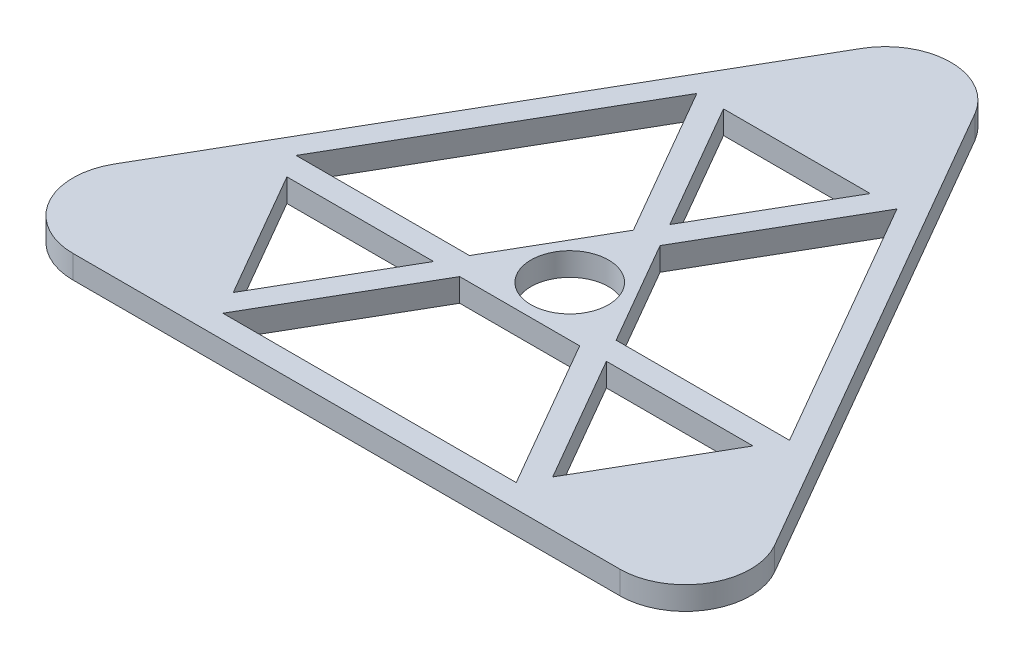
ISO-10303-21;
HEADER;
FILE_DESCRIPTION(('STEP AP214'),'2;1');
FILE_NAME('part.step','',(''),(''),'','','');
FILE_SCHEMA(('AUTOMOTIVE_DESIGN { 1 0 10303 214 1 1 1 1 }'));
ENDSEC;
DATA;
#1=APPLICATION_CONTEXT('core data for automotive mechanical design processes');
#2=APPLICATION_PROTOCOL_DEFINITION('international standard','automotive_design',2000,#1);
#3=PRODUCT_CONTEXT('',#1,'mechanical');
#4=PRODUCT('Part','Part','',(#3));
#5=PRODUCT_RELATED_PRODUCT_CATEGORY('part','',(#4));
#6=PRODUCT_DEFINITION_FORMATION('','',#4);
#7=PRODUCT_DEFINITION_CONTEXT('part definition',#1,'design');
#8=PRODUCT_DEFINITION('design','',#6,#7);
#9=PRODUCT_DEFINITION_SHAPE('','',#8);
#10=(LENGTH_UNIT() NAMED_UNIT(*) SI_UNIT(.MILLI.,.METRE.));
#11=(NAMED_UNIT(*) PLANE_ANGLE_UNIT() SI_UNIT($,.RADIAN.));
#12=(NAMED_UNIT(*) SI_UNIT($,.STERADIAN.) SOLID_ANGLE_UNIT());
#13=UNCERTAINTY_MEASURE_WITH_UNIT(LENGTH_MEASURE(1.E-05),#10,'distance_accuracy_value','');
#14=(GEOMETRIC_REPRESENTATION_CONTEXT(3) GLOBAL_UNCERTAINTY_ASSIGNED_CONTEXT((#13)) GLOBAL_UNIT_ASSIGNED_CONTEXT((#10,
#11,#12)) REPRESENTATION_CONTEXT('',''));
#15=CARTESIAN_POINT('',(0.,0.,0.));
#16=DIRECTION('',(0.,0.,1.));
#17=DIRECTION('',(1.,0.,0.));
#18=AXIS2_PLACEMENT_3D('',#15,#16,#17);
#19=CARTESIAN_POINT('',(14.9999999999507,2.,-8.66025403770422));
#20=DIRECTION('',(0.866025403787231,0.,-0.499999999995164));
#21=DIRECTION('',(-0.499999999995164,0.,-0.866025403787231));
#22=AXIS2_PLACEMENT_3D('',#19,#20,#21);
#23=PLANE('',#22);
#24=DIRECTION('',(0.499999999995164,0.,0.866025403787231));
#25=VECTOR('',#24,1.);
#26=CARTESIAN_POINT('',(14.9999999999507,0.,-8.66025403770422));
#27=LINE('',#26,#25);
#28=CARTESIAN_POINT('',(8.65470053837924,0.,-19.6506350945271));
#29=VERTEX_POINT('',#28);
#30=CARTESIAN_POINT('',(21.3452994616207,0.,2.33012701892219));
#31=VERTEX_POINT('',#30);
#32=EDGE_CURVE('E350',#29,#31,#27,.T.);
#33=ORIENTED_EDGE('',*,*,#32,.T.);
#34=DIRECTION('',(0.,-1.,0.));
#35=VECTOR('',#34,1.);
#36=CARTESIAN_POINT('',(21.3452994616207,2.,2.33012701892219));
#37=LINE('',#36,#35);
#38=CARTESIAN_POINT('',(21.3452994616207,2.,2.33012701892219));
#39=VERTEX_POINT('',#38);
#40=EDGE_CURVE('E11',#39,#31,#37,.T.);
#41=ORIENTED_EDGE('',*,*,#40,.F.);
#42=DIRECTION('',(0.499999999995164,0.,0.866025403787231));
#43=VECTOR('',#42,1.);
#44=CARTESIAN_POINT('',(14.9999999999507,2.,-8.66025403770422));
#45=LINE('',#44,#43);
#46=CARTESIAN_POINT('',(8.65470053837924,2.,-19.6506350945271));
#47=VERTEX_POINT('',#46);
#48=EDGE_CURVE('E241',#47,#39,#45,.T.);
#49=ORIENTED_EDGE('',*,*,#48,.F.);
#50=DIRECTION('',(0.,-1.,0.));
#51=VECTOR('',#50,1.);
#52=CARTESIAN_POINT('',(8.65470053837924,2.,-19.6506350945271));
#53=LINE('',#52,#51);
#54=EDGE_CURVE('E67',#47,#29,#53,.T.);
#55=ORIENTED_EDGE('',*,*,#54,.T.);
#56=EDGE_LOOP('',(#33,#41,#49,#55));
#57=FACE_BOUND('',#56,.T.);
#58=ADVANCED_FACE('F47',(#57),#23,.F.);
#59=CARTESIAN_POINT('',(1.10166797895933E-11,2.,2.33012701902311));
#60=DIRECTION('',(4.72793100962021E-12,0.,1.));
#61=DIRECTION('',(1.,0.,-4.72793100962021E-12));
#62=AXIS2_PLACEMENT_3D('',#59,#60,#61);
#63=PLANE('',#62);
#64=DIRECTION('',(-1.,0.,4.72793100962021E-12));
#65=VECTOR('',#64,1.);
#66=CARTESIAN_POINT('',(1.10166797895933E-11,0.,2.33012701902311));
#67=LINE('',#66,#65);
#68=CARTESIAN_POINT('',(6.34529946149793,0.,2.33012701899311));
#69=VERTEX_POINT('',#68);
#70=EDGE_CURVE('E248',#31,#69,#67,.T.);
#71=ORIENTED_EDGE('',*,*,#70,.T.);
#72=DIRECTION('',(0.,-1.,0.));
#73=VECTOR('',#72,1.);
#74=CARTESIAN_POINT('',(6.34529946149793,2.,2.33012701899311));
#75=LINE('',#74,#73);
#76=CARTESIAN_POINT('',(6.34529946149793,2.,2.33012701899311));
#77=VERTEX_POINT('',#76);
#78=EDGE_CURVE('E58',#77,#69,#75,.T.);
#79=ORIENTED_EDGE('',*,*,#78,.F.);
#80=DIRECTION('',(-1.,0.,4.72793100962021E-12));
#81=VECTOR('',#80,1.);
#82=CARTESIAN_POINT('',(1.10166797895933E-11,2.,2.33012701902311));
#83=LINE('',#82,#81);
#84=EDGE_CURVE('E235',#39,#77,#83,.T.);
#85=ORIENTED_EDGE('',*,*,#84,.F.);
#86=ORIENTED_EDGE('',*,*,#40,.T.);
#87=EDGE_LOOP('',(#71,#79,#85,#86));
#88=FACE_BOUND('',#87,.T.);
#89=ADVANCED_FACE('F247',(#88),#63,.F.);
#90=CARTESIAN_POINT('',(3.74999999991439,2.,-2.16506350938373));
#91=DIRECTION('',(0.866025403787232,0.,-0.499999999995161));
#92=DIRECTION('',(-0.499999999995161,0.,-0.866025403787233));
#93=AXIS2_PLACEMENT_3D('',#90,#91,#92);
#94=PLANE('',#93);
#95=DIRECTION('',(0.499999999995161,0.,0.866025403787232));
#96=VECTOR('',#95,1.);
#97=CARTESIAN_POINT('',(3.74999999991439,0.,-2.16506350938373));
#98=LINE('',#97,#96);
#99=CARTESIAN_POINT('',(1.15470053830666,0.,-6.66025403780249));
#100=VERTEX_POINT('',#99);
#101=EDGE_CURVE('E355',#100,#69,#98,.T.);
#102=ORIENTED_EDGE('',*,*,#101,.F.);
#103=DIRECTION('',(0.,-1.,0.));
#104=VECTOR('',#103,1.);
#105=CARTESIAN_POINT('',(1.15470053830666,2.,-6.66025403780249));
#106=LINE('',#105,#104);
#107=CARTESIAN_POINT('',(1.15470053830666,2.,-6.66025403780249));
#108=VERTEX_POINT('',#107);
#109=EDGE_CURVE('E150',#108,#100,#106,.T.);
#110=ORIENTED_EDGE('',*,*,#109,.F.);
#111=DIRECTION('',(0.499999999995161,0.,0.866025403787232));
#112=VECTOR('',#111,1.);
#113=CARTESIAN_POINT('',(3.74999999991439,2.,-2.16506350938373));
#114=LINE('',#113,#112);
#115=EDGE_CURVE('E240',#108,#77,#114,.T.);
#116=ORIENTED_EDGE('',*,*,#115,.T.);
#117=ORIENTED_EDGE('',*,*,#78,.T.);
#118=EDGE_LOOP('',(#102,#110,#116,#117));
#119=FACE_BOUND('',#118,.T.);
#120=ADVANCED_FACE('F253',(#119),#94,.T.);
#121=CARTESIAN_POINT('',(3.75000000010545,2.,-2.16506350952198));
#122=DIRECTION('',(-0.866025403784439,0.,0.5));
#123=DIRECTION('',(0.5,0.,0.866025403784439));
#124=AXIS2_PLACEMENT_3D('',#121,#122,#123);
#125=PLANE('',#124);
#126=DIRECTION('',(-0.5,0.,-0.866025403784439));
#127=VECTOR('',#126,1.);
#128=CARTESIAN_POINT('',(3.75000000010545,0.,-2.16506350952198));
#129=LINE('',#128,#127);
#130=CARTESIAN_POINT('',(13.8452994617262,0.,15.3205080756279));
#131=VERTEX_POINT('',#130);
#132=CARTESIAN_POINT('',(7.50000000016798,0.,4.33012701896961));
#133=VERTEX_POINT('',#132);
#134=EDGE_CURVE('E340',#131,#133,#129,.T.);
#135=ORIENTED_EDGE('',*,*,#134,.T.);
#136=DIRECTION('',(0.,-1.,0.));
#137=VECTOR('',#136,1.);
#138=CARTESIAN_POINT('',(7.50000000016798,2.,4.33012701896961));
#139=LINE('',#138,#137);
#140=CARTESIAN_POINT('',(7.50000000016798,2.,4.33012701896961));
#141=VERTEX_POINT('',#140);
#142=EDGE_CURVE('E365',#141,#133,#139,.T.);
#143=ORIENTED_EDGE('',*,*,#142,.F.);
#144=DIRECTION('',(-0.5,0.,-0.866025403784439));
#145=VECTOR('',#144,1.);
#146=CARTESIAN_POINT('',(3.75000000010545,2.,-2.16506350952198));
#147=LINE('',#146,#145);
#148=CARTESIAN_POINT('',(13.8452994617262,2.,15.3205080756279));
#149=VERTEX_POINT('',#148);
#150=EDGE_CURVE('E529',#149,#141,#147,.T.);
#151=ORIENTED_EDGE('',*,*,#150,.F.);
#152=DIRECTION('',(0.,-1.,0.));
#153=VECTOR('',#152,1.);
#154=CARTESIAN_POINT('',(13.8452994617262,2.,15.3205080756279));
#155=LINE('',#154,#153);
#156=EDGE_CURVE('E368',#149,#131,#155,.T.);
#157=ORIENTED_EDGE('',*,*,#156,.T.);
#158=EDGE_LOOP('',(#135,#143,#151,#157));
#159=FACE_BOUND('',#158,.T.);
#160=ADVANCED_FACE('F550',(#159),#125,.F.);
#161=CARTESIAN_POINT('',(0.,2.,4.33012701896961));
#162=DIRECTION('',(0.,0.,-1.));
#163=DIRECTION('',(-1.,0.,0.));
#164=AXIS2_PLACEMENT_3D('',#161,#162,#163);
#165=PLANE('',#164);
#166=DIRECTION('',(1.,0.,0.));
#167=VECTOR('',#166,1.);
#168=CARTESIAN_POINT('',(0.,0.,4.33012701896961));
#169=LINE('',#168,#167);
#170=CARTESIAN_POINT('',(20.1905989232415,0.,4.33012701896961));
#171=VERTEX_POINT('',#170);
#172=EDGE_CURVE('E344',#133,#171,#169,.T.);
#173=ORIENTED_EDGE('',*,*,#172,.T.);
#174=DIRECTION('',(0.,-1.,0.));
#175=VECTOR('',#174,1.);
#176=CARTESIAN_POINT('',(20.1905989232415,2.,4.33012701896961));
#177=LINE('',#176,#175);
#178=CARTESIAN_POINT('',(20.1905989232415,2.,4.33012701896961));
#179=VERTEX_POINT('',#178);
#180=EDGE_CURVE('E372',#179,#171,#177,.T.);
#181=ORIENTED_EDGE('',*,*,#180,.F.);
#182=DIRECTION('',(1.,0.,0.));
#183=VECTOR('',#182,1.);
#184=CARTESIAN_POINT('',(0.,2.,4.33012701896961));
#185=LINE('',#184,#183);
#186=EDGE_CURVE('E533',#141,#179,#185,.T.);
#187=ORIENTED_EDGE('',*,*,#186,.F.);
#188=ORIENTED_EDGE('',*,*,#142,.T.);
#189=EDGE_LOOP('',(#173,#181,#187,#188));
#190=FACE_BOUND('',#189,.T.);
#191=ADVANCED_FACE('F552',(#190),#165,.F.);
#192=CARTESIAN_POINT('',(-2.01794919243113,2.,-1.1650635094611));
#193=DIRECTION('',(-0.866025403784439,0.,-0.5));
#194=DIRECTION('',(-0.5,0.,0.866025403784439));
#195=AXIS2_PLACEMENT_3D('',#192,#193,#194);
#196=PLANE('',#195);
#197=DIRECTION('',(0.5,0.,-0.866025403784439));
#198=VECTOR('',#197,1.);
#199=CARTESIAN_POINT('',(-2.01794919243113,0.,-1.1650635094611));
#200=LINE('',#199,#198);
#201=CARTESIAN_POINT('',(-12.6905989232415,0.,17.3205080756888));
#202=VERTEX_POINT('',#201);
#203=CARTESIAN_POINT('',(-5.19059892324151,0.,4.33012701892219));
#204=VERTEX_POINT('',#203);
#205=EDGE_CURVE('E325',#202,#204,#200,.T.);
#206=ORIENTED_EDGE('',*,*,#205,.T.);
#207=DIRECTION('',(0.,-1.,0.));
#208=VECTOR('',#207,1.);
#209=CARTESIAN_POINT('',(-5.19059892324151,2.,4.33012701892219));
#210=LINE('',#209,#208);
#211=CARTESIAN_POINT('',(-5.19059892324151,2.,4.33012701892219));
#212=VERTEX_POINT('',#211);
#213=EDGE_CURVE('E373',#212,#204,#210,.T.);
#214=ORIENTED_EDGE('',*,*,#213,.F.);
#215=DIRECTION('',(0.5,0.,-0.866025403784439));
#216=VECTOR('',#215,1.);
#217=CARTESIAN_POINT('',(-2.01794919243113,2.,-1.1650635094611));
#218=LINE('',#217,#216);
#219=CARTESIAN_POINT('',(-12.6905989232415,2.,17.3205080756888));
#220=VERTEX_POINT('',#219);
#221=EDGE_CURVE('E515',#220,#212,#218,.T.);
#222=ORIENTED_EDGE('',*,*,#221,.F.);
#223=DIRECTION('',(0.,-1.,0.));
#224=VECTOR('',#223,1.);
#225=CARTESIAN_POINT('',(-12.6905989232415,2.,17.3205080756888));
#226=LINE('',#225,#224);
#227=EDGE_CURVE('E380',#220,#202,#226,.T.);
#228=ORIENTED_EDGE('',*,*,#227,.T.);
#229=EDGE_LOOP('',(#206,#214,#222,#228));
#230=FACE_BOUND('',#229,.T.);
#231=ADVANCED_FACE('F586',(#230),#196,.F.);
#232=CARTESIAN_POINT('',(0.,2.,4.33012701892219));
#233=DIRECTION('',(0.,0.,-1.));
#234=DIRECTION('',(-1.,0.,0.));
#235=AXIS2_PLACEMENT_3D('',#232,#233,#234);
#236=PLANE('',#235);
#237=DIRECTION('',(1.,0.,0.));
#238=VECTOR('',#237,1.);
#239=CARTESIAN_POINT('',(0.,0.,4.33012701892219));
#240=LINE('',#239,#238);
#241=CARTESIAN_POINT('',(5.1905989232415,0.,4.33012701892219));
#242=VERTEX_POINT('',#241);
#243=EDGE_CURVE('E329',#204,#242,#240,.T.);
#244=ORIENTED_EDGE('',*,*,#243,.T.);
#245=DIRECTION('',(0.,-1.,0.));
#246=VECTOR('',#245,1.);
#247=CARTESIAN_POINT('',(5.1905989232415,2.,4.33012701892219));
#248=LINE('',#247,#246);
#249=CARTESIAN_POINT('',(5.1905989232415,2.,4.33012701892219));
#250=VERTEX_POINT('',#249);
#251=EDGE_CURVE('E388',#250,#242,#248,.T.);
#252=ORIENTED_EDGE('',*,*,#251,.F.);
#253=DIRECTION('',(1.,0.,0.));
#254=VECTOR('',#253,1.);
#255=CARTESIAN_POINT('',(0.,2.,4.33012701892219));
#256=LINE('',#255,#254);
#257=EDGE_CURVE('E519',#212,#250,#256,.T.);
#258=ORIENTED_EDGE('',*,*,#257,.F.);
#259=ORIENTED_EDGE('',*,*,#213,.T.);
#260=EDGE_LOOP('',(#244,#252,#258,#259));
#261=FACE_BOUND('',#260,.T.);
#262=ADVANCED_FACE('F597',(#261),#236,.F.);
#263=CARTESIAN_POINT('',(2.01794919243112,2.,-1.1650635094611));
#264=DIRECTION('',(-0.866025403784439,0.,0.5));
#265=DIRECTION('',(0.5,0.,0.866025403784439));
#266=AXIS2_PLACEMENT_3D('',#263,#264,#265);
#267=PLANE('',#266);
#268=DIRECTION('',(-0.5,0.,-0.866025403784439));
#269=VECTOR('',#268,1.);
#270=CARTESIAN_POINT('',(2.01794919243112,0.,-1.1650635094611));
#271=LINE('',#270,#269);
#272=CARTESIAN_POINT('',(12.6905989232415,0.,17.3205080756888));
#273=VERTEX_POINT('',#272);
#274=EDGE_CURVE('E333',#273,#242,#271,.T.);
#275=ORIENTED_EDGE('',*,*,#274,.F.);
#276=DIRECTION('',(0.,-1.,0.));
#277=VECTOR('',#276,1.);
#278=CARTESIAN_POINT('',(12.6905989232415,2.,17.3205080756888));
#279=LINE('',#278,#277);
#280=CARTESIAN_POINT('',(12.6905989232415,2.,17.3205080756888));
#281=VERTEX_POINT('',#280);
#282=EDGE_CURVE('E384',#281,#273,#279,.T.);
#283=ORIENTED_EDGE('',*,*,#282,.F.);
#284=DIRECTION('',(-0.5,0.,-0.866025403784439));
#285=VECTOR('',#284,1.);
#286=CARTESIAN_POINT('',(2.01794919243112,2.,-1.1650635094611));
#287=LINE('',#286,#285);
#288=EDGE_CURVE('E522',#281,#250,#287,.T.);
#289=ORIENTED_EDGE('',*,*,#288,.T.);
#290=ORIENTED_EDGE('',*,*,#251,.T.);
#291=EDGE_LOOP('',(#275,#283,#289,#290));
#292=FACE_BOUND('',#291,.T.);
#293=ADVANCED_FACE('F593',(#292),#267,.T.);
#294=CARTESIAN_POINT('',(-16.9785928885612,2.,9.80259517467188));
#295=DIRECTION('',(-0.866025403784439,0.,0.5));
#296=DIRECTION('',(0.5,0.,0.866025403784439));
#297=AXIS2_PLACEMENT_3D('',#294,#295,#296);
#298=PLANE('',#297);
#299=DIRECTION('',(-0.5,0.,-0.866025403784439));
#300=VECTOR('',#299,1.);
#301=CARTESIAN_POINT('',(-16.9785928885612,0.,9.80259517467188));
#302=LINE('',#301,#300);
#303=CARTESIAN_POINT('',(-13.7928243897942,0.,15.3205080756888));
#304=VERTEX_POINT('',#303);
#305=CARTESIAN_POINT('',(-20.1381238514149,0.,4.33012701892219));
#306=VERTEX_POINT('',#305);
#307=EDGE_CURVE('E313',#304,#306,#302,.T.);
#308=ORIENTED_EDGE('',*,*,#307,.T.);
#309=DIRECTION('',(0.,-1.,0.));
#310=VECTOR('',#309,1.);
#311=CARTESIAN_POINT('',(-20.1381238514149,2.,4.33012701892219));
#312=LINE('',#311,#310);
#313=CARTESIAN_POINT('',(-20.1381238514149,2.,4.33012701892219));
#314=VERTEX_POINT('',#313);
#315=EDGE_CURVE('E385',#314,#306,#312,.T.);
#316=ORIENTED_EDGE('',*,*,#315,.F.);
#317=DIRECTION('',(-0.5,0.,-0.866025403784439));
#318=VECTOR('',#317,1.);
#319=CARTESIAN_POINT('',(-16.9785928885612,2.,9.80259517467188));
#320=LINE('',#319,#318);
#321=CARTESIAN_POINT('',(-13.7928243897942,2.,15.3205080756888));
#322=VERTEX_POINT('',#321);
#323=EDGE_CURVE('E504',#322,#314,#320,.T.);
#324=ORIENTED_EDGE('',*,*,#323,.F.);
#325=DIRECTION('',(0.,-1.,0.));
#326=VECTOR('',#325,1.);
#327=CARTESIAN_POINT('',(-13.7928243897942,2.,15.3205080756888));
#328=LINE('',#327,#326);
#329=EDGE_CURVE('E394',#322,#304,#328,.T.);
#330=ORIENTED_EDGE('',*,*,#329,.T.);
#331=EDGE_LOOP('',(#308,#316,#324,#330));
#332=FACE_BOUND('',#331,.T.);
#333=ADVANCED_FACE('F596',(#332),#298,.F.);
#334=CARTESIAN_POINT('',(0.,2.,4.33012701892219));
#335=DIRECTION('',(0.,0.,-1.));
#336=DIRECTION('',(-1.,0.,0.));
#337=AXIS2_PLACEMENT_3D('',#334,#335,#336);
#338=PLANE('',#337);
#339=DIRECTION('',(1.,0.,0.));
#340=VECTOR('',#339,1.);
#341=CARTESIAN_POINT('',(0.,0.,4.33012701892219));
#342=LINE('',#341,#340);
#343=CARTESIAN_POINT('',(-7.44752492817343,0.,4.33012701892219));
#344=VERTEX_POINT('',#343);
#345=EDGE_CURVE('E317',#306,#344,#342,.T.);
#346=ORIENTED_EDGE('',*,*,#345,.T.);
#347=DIRECTION('',(0.,-1.,0.));
#348=VECTOR('',#347,1.);
#349=CARTESIAN_POINT('',(-7.44752492817343,2.,4.33012701892219));
#350=LINE('',#349,#348);
#351=CARTESIAN_POINT('',(-7.44752492817343,2.,4.33012701892219));
#352=VERTEX_POINT('',#351);
#353=EDGE_CURVE('E397',#352,#344,#350,.T.);
#354=ORIENTED_EDGE('',*,*,#353,.F.);
#355=DIRECTION('',(1.,0.,0.));
#356=VECTOR('',#355,1.);
#357=CARTESIAN_POINT('',(0.,2.,4.33012701892219));
#358=LINE('',#357,#356);
#359=EDGE_CURVE('E508',#314,#352,#358,.T.);
#360=ORIENTED_EDGE('',*,*,#359,.F.);
#361=ORIENTED_EDGE('',*,*,#315,.T.);
#362=EDGE_LOOP('',(#346,#354,#360,#361));
#363=FACE_BOUND('',#362,.T.);
#364=ADVANCED_FACE('F609',(#363),#338,.F.);
#365=CARTESIAN_POINT('',(-3.74999999997147,2.,-2.16506350943531));
#366=DIRECTION('',(0.86602540378537,0.,0.499999999998387));
#367=DIRECTION('',(0.499999999998387,0.,-0.86602540378537));
#368=AXIS2_PLACEMENT_3D('',#365,#366,#367);
#369=PLANE('',#368);
#370=DIRECTION('',(-0.499999999998387,0.,0.86602540378537));
#371=VECTOR('',#370,1.);
#372=CARTESIAN_POINT('',(-3.74999999997147,0.,-2.16506350943531));
#373=LINE('',#372,#371);
#374=CARTESIAN_POINT('',(6.34529946162074,0.,-19.650635094611));
#375=VERTEX_POINT('',#374);
#376=CARTESIAN_POINT('',(-2.04749411869543E-11,0.,-8.66025403776166));
#377=VERTEX_POINT('',#376);
#378=EDGE_CURVE('E303',#375,#377,#373,.T.);
#379=ORIENTED_EDGE('',*,*,#378,.T.);
#380=DIRECTION('',(0.,-1.,0.));
#381=VECTOR('',#380,1.);
#382=CARTESIAN_POINT('',(-2.04749411869543E-11,2.,-8.66025403776166));
#383=LINE('',#382,#381);
#384=CARTESIAN_POINT('',(-2.04749411869543E-11,2.,-8.66025403776166));
#385=VERTEX_POINT('',#384);
#386=EDGE_CURVE('E398',#385,#377,#383,.T.);
#387=ORIENTED_EDGE('',*,*,#386,.F.);
#388=DIRECTION('',(-0.499999999998387,0.,0.86602540378537));
#389=VECTOR('',#388,1.);
#390=CARTESIAN_POINT('',(-3.74999999997147,2.,-2.16506350943531));
#391=LINE('',#390,#389);
#392=CARTESIAN_POINT('',(6.34529946162074,2.,-19.650635094611));
#393=VERTEX_POINT('',#392);
#394=EDGE_CURVE('E494',#393,#385,#391,.T.);
#395=ORIENTED_EDGE('',*,*,#394,.F.);
#396=DIRECTION('',(0.,-1.,0.));
#397=VECTOR('',#396,1.);
#398=CARTESIAN_POINT('',(6.34529946162074,2.,-19.650635094611));
#399=LINE('',#398,#397);
#400=EDGE_CURVE('E404',#393,#375,#399,.T.);
#401=ORIENTED_EDGE('',*,*,#400,.T.);
#402=EDGE_LOOP('',(#379,#387,#395,#401));
#403=FACE_BOUND('',#402,.T.);
#404=ADVANCED_FACE('F612',(#403),#369,.F.);
#405=CARTESIAN_POINT('',(3.74999999992866,2.,-2.16506350939662));
#406=DIRECTION('',(-0.866025403786767,0.,0.499999999995967));
#407=DIRECTION('',(0.499999999995967,0.,0.866025403786767));
#408=AXIS2_PLACEMENT_3D('',#405,#406,#407);
#409=PLANE('',#408);
#410=DIRECTION('',(-0.499999999995967,0.,-0.866025403786767));
#411=VECTOR('',#410,1.);
#412=CARTESIAN_POINT('',(3.74999999992866,0.,-2.16506350939662));
#413=LINE('',#412,#411);
#414=CARTESIAN_POINT('',(-6.34529946162075,0.,-19.650635094611));
#415=VERTEX_POINT('',#414);
#416=EDGE_CURVE('E307',#377,#415,#413,.T.);
#417=ORIENTED_EDGE('',*,*,#416,.T.);
#418=DIRECTION('',(0.,-1.,0.));
#419=VECTOR('',#418,1.);
#420=CARTESIAN_POINT('',(-6.34529946162075,2.,-19.650635094611));
#421=LINE('',#420,#419);
#422=CARTESIAN_POINT('',(-6.34529946162075,2.,-19.650635094611));
#423=VERTEX_POINT('',#422);
#424=EDGE_CURVE('E408',#423,#415,#421,.T.);
#425=ORIENTED_EDGE('',*,*,#424,.F.);
#426=DIRECTION('',(-0.499999999995967,0.,-0.866025403786767));
#427=VECTOR('',#426,1.);
#428=CARTESIAN_POINT('',(3.74999999992866,2.,-2.16506350939662));
#429=LINE('',#428,#427);
#430=EDGE_CURVE('E498',#385,#423,#429,.T.);
#431=ORIENTED_EDGE('',*,*,#430,.F.);
#432=ORIENTED_EDGE('',*,*,#386,.T.);
#433=EDGE_LOOP('',(#417,#425,#431,#432));
#434=FACE_BOUND('',#433,.T.);
#435=ADVANCED_FACE('F620',(#434),#409,.F.);
#436=CARTESIAN_POINT('',(0.,2.,2.33012701892219));
#437=DIRECTION('',(0.,0.,-1.));
#438=DIRECTION('',(-1.,0.,0.));
#439=AXIS2_PLACEMENT_3D('',#436,#437,#438);
#440=PLANE('',#439);
#441=DIRECTION('',(1.,0.,0.));
#442=VECTOR('',#441,1.);
#443=CARTESIAN_POINT('',(0.,0.,2.33012701892219));
#444=LINE('',#443,#442);
#445=CARTESIAN_POINT('',(-21.3452994616207,0.,2.3301270189222));
#446=VERTEX_POINT('',#445);
#447=CARTESIAN_POINT('',(-6.34529946162076,0.,2.33012701892219));
#448=VERTEX_POINT('',#447);
#449=EDGE_CURVE('E287',#446,#448,#444,.T.);
#450=ORIENTED_EDGE('',*,*,#449,.F.);
#451=DIRECTION('',(0.,-1.,0.));
#452=VECTOR('',#451,1.);
#453=CARTESIAN_POINT('',(-21.3452994616207,2.,2.3301270189222));
#454=LINE('',#453,#452);
#455=CARTESIAN_POINT('',(-21.3452994616207,2.,2.3301270189222));
#456=VERTEX_POINT('',#455);
#457=EDGE_CURVE('E409',#456,#446,#454,.T.);
#458=ORIENTED_EDGE('',*,*,#457,.F.);
#459=DIRECTION('',(1.,0.,0.));
#460=VECTOR('',#459,1.);
#461=CARTESIAN_POINT('',(0.,2.,2.33012701892219));
#462=LINE('',#461,#460);
#463=CARTESIAN_POINT('',(-6.34529946162076,2.,2.33012701892219));
#464=VERTEX_POINT('',#463);
#465=EDGE_CURVE('E479',#456,#464,#462,.T.);
#466=ORIENTED_EDGE('',*,*,#465,.T.);
#467=DIRECTION('',(0.,-1.,0.));
#468=VECTOR('',#467,1.);
#469=CARTESIAN_POINT('',(-6.34529946162076,2.,2.33012701892219));
#470=LINE('',#469,#468);
#471=EDGE_CURVE('E416',#464,#448,#470,.T.);
#472=ORIENTED_EDGE('',*,*,#471,.T.);
#473=EDGE_LOOP('',(#450,#458,#466,#472));
#474=FACE_BOUND('',#473,.T.);
#475=ADVANCED_FACE('F623',(#474),#440,.T.);
#476=CARTESIAN_POINT('',(-15.,2.,-8.66025403784439));
#477=DIRECTION('',(0.866025403784439,0.,0.5));
#478=DIRECTION('',(0.5,0.,-0.866025403784439));
#479=AXIS2_PLACEMENT_3D('',#476,#477,#478);
#480=PLANE('',#479);
#481=DIRECTION('',(-0.5,0.,0.866025403784439));
#482=VECTOR('',#481,1.);
#483=CARTESIAN_POINT('',(-15.,0.,-8.66025403784439));
#484=LINE('',#483,#482);
#485=CARTESIAN_POINT('',(-8.65470053837925,0.,-19.650635094611));
#486=VERTEX_POINT('',#485);
#487=EDGE_CURVE('E291',#486,#446,#484,.T.);
#488=ORIENTED_EDGE('',*,*,#487,.F.);
#489=DIRECTION('',(0.,-1.,0.));
#490=VECTOR('',#489,1.);
#491=CARTESIAN_POINT('',(-8.65470053837925,2.,-19.650635094611));
#492=LINE('',#491,#490);
#493=CARTESIAN_POINT('',(-8.65470053837925,2.,-19.650635094611));
#494=VERTEX_POINT('',#493);
#495=EDGE_CURVE('E423',#494,#486,#492,.T.);
#496=ORIENTED_EDGE('',*,*,#495,.F.);
#497=DIRECTION('',(-0.5,0.,0.866025403784439));
#498=VECTOR('',#497,1.);
#499=CARTESIAN_POINT('',(-15.,2.,-8.66025403784439));
#500=LINE('',#499,#498);
#501=EDGE_CURVE('E483',#494,#456,#500,.T.);
#502=ORIENTED_EDGE('',*,*,#501,.T.);
#503=ORIENTED_EDGE('',*,*,#457,.T.);
#504=EDGE_LOOP('',(#488,#496,#502,#503));
#505=FACE_BOUND('',#504,.T.);
#506=ADVANCED_FACE('F634',(#505),#480,.T.);
#507=CARTESIAN_POINT('',(2.01794919243112,2.,-1.1650635094611));
#508=DIRECTION('',(0.866025403784439,0.,-0.5));
#509=DIRECTION('',(-0.5,0.,-0.866025403784439));
#510=AXIS2_PLACEMENT_3D('',#507,#508,#509);
#511=PLANE('',#510);
#512=DIRECTION('',(0.5,0.,0.866025403784439));
#513=VECTOR('',#512,1.);
#514=CARTESIAN_POINT('',(2.01794919243112,0.,-1.1650635094611));
#515=LINE('',#514,#513);
#516=CARTESIAN_POINT('',(-1.15470053837926,0.,-6.6602540378444));
#517=VERTEX_POINT('',#516);
#518=EDGE_CURVE('E295',#486,#517,#515,.T.);
#519=ORIENTED_EDGE('',*,*,#518,.T.);
#520=DIRECTION('',(0.,-1.,0.));
#521=VECTOR('',#520,1.);
#522=CARTESIAN_POINT('',(-1.15470053837926,2.,-6.6602540378444));
#523=LINE('',#522,#521);
#524=CARTESIAN_POINT('',(-1.15470053837926,2.,-6.6602540378444));
#525=VERTEX_POINT('',#524);
#526=EDGE_CURVE('E419',#525,#517,#523,.T.);
#527=ORIENTED_EDGE('',*,*,#526,.F.);
#528=DIRECTION('',(0.5,0.,0.866025403784439));
#529=VECTOR('',#528,1.);
#530=CARTESIAN_POINT('',(2.01794919243112,2.,-1.1650635094611));
#531=LINE('',#530,#529);
#532=EDGE_CURVE('E487',#494,#525,#531,.T.);
#533=ORIENTED_EDGE('',*,*,#532,.F.);
#534=ORIENTED_EDGE('',*,*,#495,.T.);
#535=EDGE_LOOP('',(#519,#527,#533,#534));
#536=FACE_BOUND('',#535,.T.);
#537=ADVANCED_FACE('F631',(#536),#511,.F.);
#538=CARTESIAN_POINT('',(0.,2.,-27.3140954468665));
#539=DIRECTION('',(0.,-1.,0.));
#540=DIRECTION('',(0.,0.,-1.));
#541=AXIS2_PLACEMENT_3D('',#538,#539,#540);
#542=CYLINDRICAL_SURFACE('',#541,5.66346035225553);
#543=CARTESIAN_POINT('',(0.,0.,-27.3140954468665));
#544=DIRECTION('',(0.,1.,0.));
#545=DIRECTION('',(0.,0.,1.));
#546=AXIS2_PLACEMENT_3D('',#543,#544,#545);
#547=CIRCLE('',#546,5.66346035225553);
#548=CARTESIAN_POINT('',(-4.90470053837926,0.,-30.1458256229943));
#549=VERTEX_POINT('',#548);
#550=CARTESIAN_POINT('',(4.90470053837924,0.,-30.1458256229943));
#551=VERTEX_POINT('',#550);
#552=EDGE_CURVE('E262',#549,#551,#547,.F.);
#553=ORIENTED_EDGE('',*,*,#552,.F.);
#554=DIRECTION('',(0.,-1.,0.));
#555=VECTOR('',#554,1.);
#556=CARTESIAN_POINT('',(-4.90470053837926,2.,-30.1458256229943));
#557=LINE('',#556,#555);
#558=CARTESIAN_POINT('',(-4.90470053837926,2.,-30.1458256229943));
#559=VERTEX_POINT('',#558);
#560=EDGE_CURVE('E51',#559,#549,#557,.T.);
#561=ORIENTED_EDGE('',*,*,#560,.F.);
#562=CARTESIAN_POINT('',(0.,2.,-27.3140954468665));
#563=DIRECTION('',(0.,1.,0.));
#564=DIRECTION('',(0.,0.,1.));
#565=AXIS2_PLACEMENT_3D('',#562,#563,#564);
#566=CIRCLE('',#565,5.66346035225553);
#567=CARTESIAN_POINT('',(4.90470053837924,2.,-30.1458256229943));
#568=VERTEX_POINT('',#567);
#569=EDGE_CURVE('E362',#559,#568,#566,.F.);
#570=ORIENTED_EDGE('',*,*,#569,.T.);
#571=DIRECTION('',(0.,-1.,0.));
#572=VECTOR('',#571,1.);
#573=CARTESIAN_POINT('',(4.90470053837924,2.,-30.1458256229943));
#574=LINE('',#573,#572);
#575=EDGE_CURVE('E258',#568,#551,#574,.T.);
#576=ORIENTED_EDGE('',*,*,#575,.T.);
#577=EDGE_LOOP('',(#553,#561,#570,#576));
#578=FACE_BOUND('',#577,.T.);
#579=ADVANCED_FACE('F49',(#578),#542,.T.);
#580=CARTESIAN_POINT('',(-16.7320508075689,2.,-9.66025403784439));
#581=DIRECTION('',(-0.866025403784439,0.,-0.5));
#582=DIRECTION('',(-0.5,0.,0.866025403784439));
#583=AXIS2_PLACEMENT_3D('',#580,#581,#582);
#584=PLANE('',#583);
#585=DIRECTION('',(0.5,0.,-0.866025403784439));
#586=VECTOR('',#585,1.);
#587=CARTESIAN_POINT('',(-16.7320508075689,0.,-9.66025403784439));
#588=LINE('',#587,#586);
#589=CARTESIAN_POINT('',(-28.5594010767585,0.,10.8253175473055));
#590=VERTEX_POINT('',#589);
#591=EDGE_CURVE('E266',#590,#549,#588,.T.);
#592=ORIENTED_EDGE('',*,*,#591,.F.);
#593=DIRECTION('',(0.,-1.,0.));
#594=VECTOR('',#593,1.);
#595=CARTESIAN_POINT('',(-28.5594010767585,2.,10.8253175473055));
#596=LINE('',#595,#594);
#597=CARTESIAN_POINT('',(-28.5594010767585,2.,10.8253175473055));
#598=VERTEX_POINT('',#597);
#599=EDGE_CURVE('E438',#598,#590,#596,.T.);
#600=ORIENTED_EDGE('',*,*,#599,.F.);
#601=DIRECTION('',(0.5,0.,-0.866025403784439));
#602=VECTOR('',#601,1.);
#603=CARTESIAN_POINT('',(-16.7320508075689,2.,-9.66025403784439));
#604=LINE('',#603,#602);
#605=EDGE_CURVE('E449',#598,#559,#604,.T.);
#606=ORIENTED_EDGE('',*,*,#605,.T.);
#607=ORIENTED_EDGE('',*,*,#560,.T.);
#608=EDGE_LOOP('',(#592,#600,#606,#607));
#609=FACE_BOUND('',#608,.T.);
#610=ADVANCED_FACE('F447',(#609),#584,.T.);
#611=CARTESIAN_POINT('',(-23.6547005383793,2.,13.6570477234332));
#612=DIRECTION('',(0.,-1.,0.));
#613=DIRECTION('',(0.,0.,-1.));
#614=AXIS2_PLACEMENT_3D('',#611,#612,#613);
#615=CYLINDRICAL_SURFACE('',#614,5.66346035225553);
#616=CARTESIAN_POINT('',(-23.6547005383793,0.,13.6570477234332));
#617=DIRECTION('',(0.,1.,0.));
#618=DIRECTION('',(0.,0.,1.));
#619=AXIS2_PLACEMENT_3D('',#616,#617,#618);
#620=CIRCLE('',#619,5.66346035225553);
#621=CARTESIAN_POINT('',(-23.6547005383793,0.,19.3205080756888));
#622=VERTEX_POINT('',#621);
#623=EDGE_CURVE('E271',#590,#622,#620,.T.);
#624=ORIENTED_EDGE('',*,*,#623,.T.);
#625=DIRECTION('',(0.,-1.,0.));
#626=VECTOR('',#625,1.);
#627=CARTESIAN_POINT('',(-23.6547005383793,2.,19.3205080756888));
#628=LINE('',#627,#626);
#629=CARTESIAN_POINT('',(-23.6547005383793,2.,19.3205080756888));
#630=VERTEX_POINT('',#629);
#631=EDGE_CURVE('E436',#630,#622,#628,.T.);
#632=ORIENTED_EDGE('',*,*,#631,.F.);
#633=CARTESIAN_POINT('',(-23.6547005383793,2.,13.6570477234332));
#634=DIRECTION('',(0.,1.,0.));
#635=DIRECTION('',(0.,0.,1.));
#636=AXIS2_PLACEMENT_3D('',#633,#634,#635);
#637=CIRCLE('',#636,5.66346035225553);
#638=EDGE_CURVE('E458',#598,#630,#637,.T.);
#639=ORIENTED_EDGE('',*,*,#638,.F.);
#640=ORIENTED_EDGE('',*,*,#599,.T.);
#641=EDGE_LOOP('',(#624,#632,#639,#640));
#642=FACE_BOUND('',#641,.T.);
#643=ADVANCED_FACE('F456',(#642),#615,.T.);
#644=CARTESIAN_POINT('',(0.,2.,19.3205080756888));
#645=DIRECTION('',(0.,0.,1.));
#646=DIRECTION('',(1.,0.,0.));
#647=AXIS2_PLACEMENT_3D('',#644,#645,#646);
#648=PLANE('',#647);
#649=DIRECTION('',(-1.,0.,0.));
#650=VECTOR('',#649,1.);
#651=CARTESIAN_POINT('',(0.,0.,19.3205080756888));
#652=LINE('',#651,#650);
#653=CARTESIAN_POINT('',(23.6547005383792,0.,19.3205080756888));
#654=VERTEX_POINT('',#653);
#655=EDGE_CURVE('E275',#654,#622,#652,.T.);
#656=ORIENTED_EDGE('',*,*,#655,.F.);
#657=DIRECTION('',(0.,-1.,0.));
#658=VECTOR('',#657,1.);
#659=CARTESIAN_POINT('',(23.6547005383792,2.,19.3205080756888));
#660=LINE('',#659,#658);
#661=CARTESIAN_POINT('',(23.6547005383792,2.,19.3205080756888));
#662=VERTEX_POINT('',#661);
#663=EDGE_CURVE('E433',#662,#654,#660,.T.);
#664=ORIENTED_EDGE('',*,*,#663,.F.);
#665=DIRECTION('',(-1.,0.,0.));
#666=VECTOR('',#665,1.);
#667=CARTESIAN_POINT('',(0.,2.,19.3205080756888));
#668=LINE('',#667,#666);
#669=EDGE_CURVE('E461',#662,#630,#668,.T.);
#670=ORIENTED_EDGE('',*,*,#669,.T.);
#671=ORIENTED_EDGE('',*,*,#631,.T.);
#672=EDGE_LOOP('',(#656,#664,#670,#671));
#673=FACE_BOUND('',#672,.T.);
#674=ADVANCED_FACE('F462',(#673),#648,.T.);
#675=CARTESIAN_POINT('',(23.6547005383792,2.,13.6570477234332));
#676=DIRECTION('',(0.,-1.,0.));
#677=DIRECTION('',(0.,0.,-1.));
#678=AXIS2_PLACEMENT_3D('',#675,#676,#677);
#679=CYLINDRICAL_SURFACE('',#678,5.66346035225553);
#680=CARTESIAN_POINT('',(23.6547005383792,0.,13.6570477234332));
#681=DIRECTION('',(0.,1.,0.));
#682=DIRECTION('',(0.,0.,1.));
#683=AXIS2_PLACEMENT_3D('',#680,#681,#682);
#684=CIRCLE('',#683,5.66346035225553);
#685=CARTESIAN_POINT('',(28.5594010767585,0.,10.8253175473055));
#686=VERTEX_POINT('',#685);
#687=EDGE_CURVE('E279',#686,#654,#684,.F.);
#688=ORIENTED_EDGE('',*,*,#687,.F.);
#689=DIRECTION('',(0.,-1.,0.));
#690=VECTOR('',#689,1.);
#691=CARTESIAN_POINT('',(28.5594010767585,2.,10.8253175473055));
#692=LINE('',#691,#690);
#693=CARTESIAN_POINT('',(28.5594010767585,2.,10.8253175473055));
#694=VERTEX_POINT('',#693);
#695=EDGE_CURVE('E430',#694,#686,#692,.T.);
#696=ORIENTED_EDGE('',*,*,#695,.F.);
#697=CARTESIAN_POINT('',(23.6547005383792,2.,13.6570477234332));
#698=DIRECTION('',(0.,1.,0.));
#699=DIRECTION('',(0.,0.,1.));
#700=AXIS2_PLACEMENT_3D('',#697,#698,#699);
#701=CIRCLE('',#700,5.66346035225553);
#702=EDGE_CURVE('E467',#694,#662,#701,.F.);
#703=ORIENTED_EDGE('',*,*,#702,.T.);
#704=ORIENTED_EDGE('',*,*,#663,.T.);
#705=EDGE_LOOP('',(#688,#696,#703,#704));
#706=FACE_BOUND('',#705,.T.);
#707=ADVANCED_FACE('F583',(#706),#679,.T.);
#708=CARTESIAN_POINT('',(17.0179491924965,2.,9.82531754727676));
#709=DIRECTION('',(0.866025403785904,0.,0.499999999997462));
#710=DIRECTION('',(0.499999999997462,0.,-0.866025403785904));
#711=AXIS2_PLACEMENT_3D('',#708,#709,#710);
#712=PLANE('',#711);
#713=DIRECTION('',(-0.499999999997462,0.,0.866025403785904));
#714=VECTOR('',#713,1.);
#715=CARTESIAN_POINT('',(17.0179491924965,0.,9.82531754727676));
#716=LINE('',#715,#714);
#717=EDGE_CURVE('E347',#171,#131,#716,.T.);
#718=ORIENTED_EDGE('',*,*,#717,.T.);
#719=ORIENTED_EDGE('',*,*,#156,.F.);
#720=DIRECTION('',(-0.499999999997462,0.,0.866025403785904));
#721=VECTOR('',#720,1.);
#722=CARTESIAN_POINT('',(17.0179491924965,2.,9.82531754727676));
#723=LINE('',#722,#721);
#724=EDGE_CURVE('E536',#179,#149,#723,.T.);
#725=ORIENTED_EDGE('',*,*,#724,.F.);
#726=ORIENTED_EDGE('',*,*,#180,.T.);
#727=EDGE_LOOP('',(#718,#719,#725,#726));
#728=FACE_BOUND('',#727,.T.);
#729=ADVANCED_FACE('F546',(#728),#712,.F.);
#730=CARTESIAN_POINT('',(0.,2.,17.3205080756888));
#731=DIRECTION('',(0.,0.,1.));
#732=DIRECTION('',(1.,0.,0.));
#733=AXIS2_PLACEMENT_3D('',#730,#731,#732);
#734=PLANE('',#733);
#735=DIRECTION('',(-1.,0.,0.));
#736=VECTOR('',#735,1.);
#737=CARTESIAN_POINT('',(0.,0.,17.3205080756888));
#738=LINE('',#737,#736);
#739=EDGE_CURVE('E337',#273,#202,#738,.T.);
#740=ORIENTED_EDGE('',*,*,#739,.T.);
#741=ORIENTED_EDGE('',*,*,#227,.F.);
#742=DIRECTION('',(-1.,0.,0.));
#743=VECTOR('',#742,1.);
#744=CARTESIAN_POINT('',(0.,2.,17.3205080756888));
#745=LINE('',#744,#743);
#746=EDGE_CURVE('E526',#281,#220,#745,.T.);
#747=ORIENTED_EDGE('',*,*,#746,.F.);
#748=ORIENTED_EDGE('',*,*,#282,.T.);
#749=EDGE_LOOP('',(#740,#741,#747,#748));
#750=FACE_BOUND('',#749,.T.);
#751=ADVANCED_FACE('F582',(#750),#734,.F.);
#752=CARTESIAN_POINT('',(-3.71064369613007,2.,-2.14234113682748));
#753=DIRECTION('',(-0.866025403784439,0.,-0.5));
#754=DIRECTION('',(-0.5,0.,0.866025403784439));
#755=AXIS2_PLACEMENT_3D('',#752,#753,#754);
#756=PLANE('',#755);
#757=DIRECTION('',(0.5,0.,-0.866025403784439));
#758=VECTOR('',#757,1.);
#759=CARTESIAN_POINT('',(-3.71064369613007,0.,-2.14234113682748));
#760=LINE('',#759,#758);
#761=EDGE_CURVE('E321',#304,#344,#760,.T.);
#762=ORIENTED_EDGE('',*,*,#761,.F.);
#763=ORIENTED_EDGE('',*,*,#329,.F.);
#764=DIRECTION('',(0.5,0.,-0.866025403784439));
#765=VECTOR('',#764,1.);
#766=CARTESIAN_POINT('',(-3.71064369613007,2.,-2.14234113682748));
#767=LINE('',#766,#765);
#768=EDGE_CURVE('E511',#322,#352,#767,.T.);
#769=ORIENTED_EDGE('',*,*,#768,.T.);
#770=ORIENTED_EDGE('',*,*,#353,.T.);
#771=EDGE_LOOP('',(#762,#763,#769,#770));
#772=FACE_BOUND('',#771,.T.);
#773=ADVANCED_FACE('F591',(#772),#756,.T.);
#774=CARTESIAN_POINT('',(0.,2.,-19.650635094611));
#775=DIRECTION('',(0.,0.,-1.));
#776=DIRECTION('',(-1.,0.,0.));
#777=AXIS2_PLACEMENT_3D('',#774,#775,#776);
#778=PLANE('',#777);
#779=DIRECTION('',(1.,0.,0.));
#780=VECTOR('',#779,1.);
#781=CARTESIAN_POINT('',(0.,0.,-19.650635094611));
#782=LINE('',#781,#780);
#783=EDGE_CURVE('E310',#415,#375,#782,.T.);
#784=ORIENTED_EDGE('',*,*,#783,.T.);
#785=ORIENTED_EDGE('',*,*,#400,.F.);
#786=DIRECTION('',(1.,0.,0.));
#787=VECTOR('',#786,1.);
#788=CARTESIAN_POINT('',(0.,2.,-19.650635094611));
#789=LINE('',#788,#787);
#790=EDGE_CURVE('E501',#423,#393,#789,.T.);
#791=ORIENTED_EDGE('',*,*,#790,.F.);
#792=ORIENTED_EDGE('',*,*,#424,.T.);
#793=EDGE_LOOP('',(#784,#785,#791,#792));
#794=FACE_BOUND('',#793,.T.);
#795=ADVANCED_FACE('F607',(#794),#778,.F.);
#796=CARTESIAN_POINT('',(-3.75000000000001,2.,-2.1650635094611));
#797=DIRECTION('',(0.866025403784439,0.,0.5));
#798=DIRECTION('',(0.5,0.,-0.866025403784439));
#799=AXIS2_PLACEMENT_3D('',#796,#797,#798);
#800=PLANE('',#799);
#801=DIRECTION('',(-0.5,0.,0.866025403784439));
#802=VECTOR('',#801,1.);
#803=CARTESIAN_POINT('',(-3.75000000000001,0.,-2.1650635094611));
#804=LINE('',#803,#802);
#805=EDGE_CURVE('E299',#517,#448,#804,.T.);
#806=ORIENTED_EDGE('',*,*,#805,.T.);
#807=ORIENTED_EDGE('',*,*,#471,.F.);
#808=DIRECTION('',(-0.5,0.,0.866025403784439));
#809=VECTOR('',#808,1.);
#810=CARTESIAN_POINT('',(-3.75000000000001,2.,-2.1650635094611));
#811=LINE('',#810,#809);
#812=EDGE_CURVE('E491',#525,#464,#811,.T.);
#813=ORIENTED_EDGE('',*,*,#812,.F.);
#814=ORIENTED_EDGE('',*,*,#526,.T.);
#815=EDGE_LOOP('',(#806,#807,#813,#814));
#816=FACE_BOUND('',#815,.T.);
#817=ADVANCED_FACE('F569',(#816),#800,.F.);
#818=CARTESIAN_POINT('',(16.7320508075689,2.,-9.66025403784438));
#819=DIRECTION('',(0.866025403784439,0.,-0.5));
#820=DIRECTION('',(-0.5,0.,-0.866025403784439));
#821=AXIS2_PLACEMENT_3D('',#818,#819,#820);
#822=PLANE('',#821);
#823=DIRECTION('',(0.5,0.,0.866025403784439));
#824=VECTOR('',#823,1.);
#825=CARTESIAN_POINT('',(16.7320508075689,0.,-9.66025403784438));
#826=LINE('',#825,#824);
#827=EDGE_CURVE('E283',#551,#686,#826,.T.);
#828=ORIENTED_EDGE('',*,*,#827,.F.);
#829=ORIENTED_EDGE('',*,*,#575,.F.);
#830=DIRECTION('',(0.5,0.,0.866025403784439));
#831=VECTOR('',#830,1.);
#832=CARTESIAN_POINT('',(16.7320508075689,2.,-9.66025403784438));
#833=LINE('',#832,#831);
#834=EDGE_CURVE('E471',#568,#694,#833,.T.);
#835=ORIENTED_EDGE('',*,*,#834,.T.);
#836=ORIENTED_EDGE('',*,*,#695,.T.);
#837=EDGE_LOOP('',(#828,#829,#835,#836));
#838=FACE_BOUND('',#837,.T.);
#839=ADVANCED_FACE('F561',(#838),#822,.T.);
#840=CARTESIAN_POINT('',(-2.01794919249162,2.,-1.16506350951106));
#841=DIRECTION('',(0.866025403781645,0.,0.500000000004839));
#842=DIRECTION('',(0.500000000004839,0.,-0.866025403781645));
#843=AXIS2_PLACEMENT_3D('',#840,#841,#842);
#844=PLANE('',#843);
#845=DIRECTION('',(-0.500000000004839,0.,0.866025403781645));
#846=VECTOR('',#845,1.);
#847=CARTESIAN_POINT('',(-2.01794919249162,0.,-1.16506350951106));
#848=LINE('',#847,#846);
#849=EDGE_CURVE('E358',#29,#100,#848,.T.);
#850=ORIENTED_EDGE('',*,*,#849,.F.);
#851=ORIENTED_EDGE('',*,*,#54,.F.);
#852=DIRECTION('',(-0.500000000004839,0.,0.866025403781645));
#853=VECTOR('',#852,1.);
#854=CARTESIAN_POINT('',(-2.01794919249162,2.,-1.16506350951106));
#855=LINE('',#854,#853);
#856=EDGE_CURVE('E255',#47,#108,#855,.T.);
#857=ORIENTED_EDGE('',*,*,#856,.T.);
#858=ORIENTED_EDGE('',*,*,#109,.T.);
#859=EDGE_LOOP('',(#850,#851,#857,#858));
#860=FACE_BOUND('',#859,.T.);
#861=ADVANCED_FACE('F559',(#860),#844,.T.);
#862=CARTESIAN_POINT('',(0.,2.,0.));
#863=DIRECTION('',(0.,1.,0.));
#864=DIRECTION('',(0.,0.,1.));
#865=AXIS2_PLACEMENT_3D('',#862,#863,#864);
#866=PLANE('',#865);
#867=CARTESIAN_POINT('',(0.,2.,0.));
#868=DIRECTION('',(0.,1.,0.));
#869=DIRECTION('',(0.,0.,1.));
#870=AXIS2_PLACEMENT_3D('',#867,#868,#869);
#871=CIRCLE('',#870,3.35601343012962);
#872=CARTESIAN_POINT('',(0.,2.,3.35601343012962));
#873=VERTEX_POINT('',#872);
#874=EDGE_CURVE('E917',#873,#873,#871,.T.);
#875=ORIENTED_EDGE('',*,*,#874,.F.);
#876=EDGE_LOOP('',(#875));
#877=FACE_BOUND('',#876,.T.);
#878=ORIENTED_EDGE('',*,*,#569,.F.);
#879=ORIENTED_EDGE('',*,*,#605,.F.);
#880=ORIENTED_EDGE('',*,*,#638,.T.);
#881=ORIENTED_EDGE('',*,*,#669,.F.);
#882=ORIENTED_EDGE('',*,*,#702,.F.);
#883=ORIENTED_EDGE('',*,*,#834,.F.);
#884=EDGE_LOOP('',(#878,#879,#880,#881,#882,#883));
#885=FACE_BOUND('',#884,.T.);
#886=ORIENTED_EDGE('',*,*,#465,.F.);
#887=ORIENTED_EDGE('',*,*,#501,.F.);
#888=ORIENTED_EDGE('',*,*,#532,.T.);
#889=ORIENTED_EDGE('',*,*,#812,.T.);
#890=EDGE_LOOP('',(#886,#887,#888,#889));
#891=FACE_BOUND('',#890,.T.);
#892=ORIENTED_EDGE('',*,*,#394,.T.);
#893=ORIENTED_EDGE('',*,*,#430,.T.);
#894=ORIENTED_EDGE('',*,*,#790,.T.);
#895=EDGE_LOOP('',(#892,#893,#894));
#896=FACE_BOUND('',#895,.T.);
#897=ORIENTED_EDGE('',*,*,#323,.T.);
#898=ORIENTED_EDGE('',*,*,#359,.T.);
#899=ORIENTED_EDGE('',*,*,#768,.F.);
#900=EDGE_LOOP('',(#897,#898,#899));
#901=FACE_BOUND('',#900,.T.);
#902=ORIENTED_EDGE('',*,*,#221,.T.);
#903=ORIENTED_EDGE('',*,*,#257,.T.);
#904=ORIENTED_EDGE('',*,*,#288,.F.);
#905=ORIENTED_EDGE('',*,*,#746,.T.);
#906=EDGE_LOOP('',(#902,#903,#904,#905));
#907=FACE_BOUND('',#906,.T.);
#908=ORIENTED_EDGE('',*,*,#150,.T.);
#909=ORIENTED_EDGE('',*,*,#186,.T.);
#910=ORIENTED_EDGE('',*,*,#724,.T.);
#911=EDGE_LOOP('',(#908,#909,#910));
#912=FACE_BOUND('',#911,.T.);
#913=ORIENTED_EDGE('',*,*,#48,.T.);
#914=ORIENTED_EDGE('',*,*,#84,.T.);
#915=ORIENTED_EDGE('',*,*,#115,.F.);
#916=ORIENTED_EDGE('',*,*,#856,.F.);
#917=EDGE_LOOP('',(#913,#914,#915,#916));
#918=FACE_BOUND('',#917,.T.);
#919=ADVANCED_FACE('F237',(#877,#885,#891,#896,#901,#907,#912,#918),#866,.T.);
#920=CARTESIAN_POINT('',(0.,0.,0.));
#921=DIRECTION('',(0.,1.,0.));
#922=DIRECTION('',(0.,0.,1.));
#923=AXIS2_PLACEMENT_3D('',#920,#921,#922);
#924=PLANE('',#923);
#925=CARTESIAN_POINT('',(0.,0.,0.));
#926=DIRECTION('',(0.,1.,0.));
#927=DIRECTION('',(0.,0.,1.));
#928=AXIS2_PLACEMENT_3D('',#925,#926,#927);
#929=CIRCLE('',#928,3.35601343012962);
#930=CARTESIAN_POINT('',(0.,0.,3.35601343012962));
#931=VERTEX_POINT('',#930);
#932=EDGE_CURVE('E267',#931,#931,#929,.T.);
#933=ORIENTED_EDGE('',*,*,#932,.T.);
#934=EDGE_LOOP('',(#933));
#935=FACE_BOUND('',#934,.T.);
#936=ORIENTED_EDGE('',*,*,#552,.T.);
#937=ORIENTED_EDGE('',*,*,#827,.T.);
#938=ORIENTED_EDGE('',*,*,#687,.T.);
#939=ORIENTED_EDGE('',*,*,#655,.T.);
#940=ORIENTED_EDGE('',*,*,#623,.F.);
#941=ORIENTED_EDGE('',*,*,#591,.T.);
#942=EDGE_LOOP('',(#936,#937,#938,#939,#940,#941));
#943=FACE_BOUND('',#942,.T.);
#944=ORIENTED_EDGE('',*,*,#449,.T.);
#945=ORIENTED_EDGE('',*,*,#805,.F.);
#946=ORIENTED_EDGE('',*,*,#518,.F.);
#947=ORIENTED_EDGE('',*,*,#487,.T.);
#948=EDGE_LOOP('',(#944,#945,#946,#947));
#949=FACE_BOUND('',#948,.T.);
#950=ORIENTED_EDGE('',*,*,#378,.F.);
#951=ORIENTED_EDGE('',*,*,#783,.F.);
#952=ORIENTED_EDGE('',*,*,#416,.F.);
#953=EDGE_LOOP('',(#950,#951,#952));
#954=FACE_BOUND('',#953,.T.);
#955=ORIENTED_EDGE('',*,*,#307,.F.);
#956=ORIENTED_EDGE('',*,*,#761,.T.);
#957=ORIENTED_EDGE('',*,*,#345,.F.);
#958=EDGE_LOOP('',(#955,#956,#957));
#959=FACE_BOUND('',#958,.T.);
#960=ORIENTED_EDGE('',*,*,#205,.F.);
#961=ORIENTED_EDGE('',*,*,#739,.F.);
#962=ORIENTED_EDGE('',*,*,#274,.T.);
#963=ORIENTED_EDGE('',*,*,#243,.F.);
#964=EDGE_LOOP('',(#960,#961,#962,#963));
#965=FACE_BOUND('',#964,.T.);
#966=ORIENTED_EDGE('',*,*,#134,.F.);
#967=ORIENTED_EDGE('',*,*,#717,.F.);
#968=ORIENTED_EDGE('',*,*,#172,.F.);
#969=EDGE_LOOP('',(#966,#967,#968));
#970=FACE_BOUND('',#969,.T.);
#971=ORIENTED_EDGE('',*,*,#32,.F.);
#972=ORIENTED_EDGE('',*,*,#849,.T.);
#973=ORIENTED_EDGE('',*,*,#101,.T.);
#974=ORIENTED_EDGE('',*,*,#70,.F.);
#975=EDGE_LOOP('',(#971,#972,#973,#974));
#976=FACE_BOUND('',#975,.T.);
#977=ADVANCED_FACE('F452',(#935,#943,#949,#954,#959,#965,#970,#976),#924,.F.);
#978=CARTESIAN_POINT('',(0.,0.,0.));
#979=DIRECTION('',(0.,1.,0.));
#980=DIRECTION('',(0.,0.,1.));
#981=AXIS2_PLACEMENT_3D('',#978,#979,#980);
#982=CYLINDRICAL_SURFACE('',#981,3.35601343012962);
#983=ORIENTED_EDGE('',*,*,#932,.F.);
#984=EDGE_LOOP('',(#983));
#985=FACE_BOUND('',#984,.T.);
#986=ORIENTED_EDGE('',*,*,#874,.T.);
#987=EDGE_LOOP('',(#986));
#988=FACE_BOUND('',#987,.T.);
#989=ADVANCED_FACE('F556',(#985,#988),#982,.F.);
#990=CLOSED_SHELL('',(#58,#89,#120,#160,#191,#231,#262,#293,#333,#364,#404,#435,#475,#506,#537,
#579,#610,#643,#674,#707,#729,#751,#773,#795,#817,#839,#861,#919,#977,#989));
#991=MANIFOLD_SOLID_BREP('B2',#990);
#992=ADVANCED_BREP_SHAPE_REPRESENTATION('',(#18,#991),#14);
#993=SHAPE_DEFINITION_REPRESENTATION(#9,#992);
ENDSEC;
END-ISO-10303-21;
